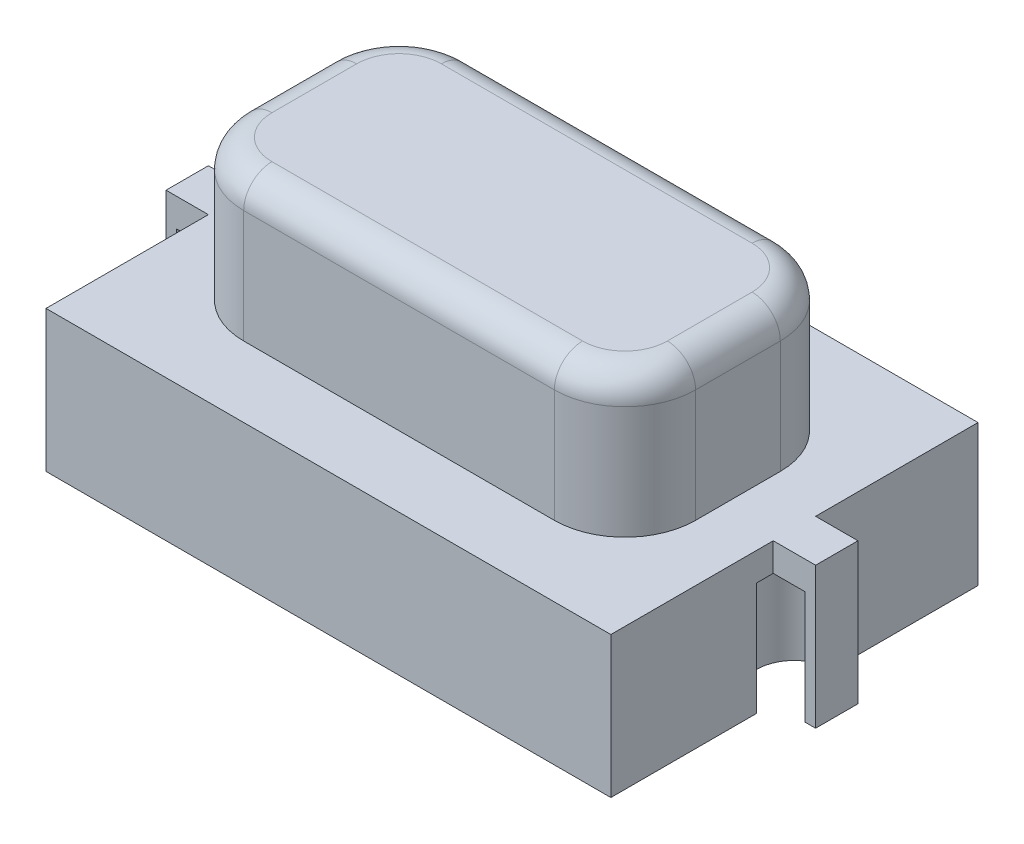
ISO-10303-21;
HEADER;
FILE_DESCRIPTION(('STEP AP214'),'2;1');
FILE_NAME('part.step','',(''),(''),'','','');
FILE_SCHEMA(('AUTOMOTIVE_DESIGN { 1 0 10303 214 1 1 1 1 }'));
ENDSEC;
DATA;
#1=APPLICATION_CONTEXT('core data for automotive mechanical design processes');
#2=APPLICATION_PROTOCOL_DEFINITION('international standard','automotive_design',2000,#1);
#3=PRODUCT_CONTEXT('',#1,'mechanical');
#4=PRODUCT('Part','Part','',(#3));
#5=PRODUCT_RELATED_PRODUCT_CATEGORY('part','',(#4));
#6=PRODUCT_DEFINITION_FORMATION('','',#4);
#7=PRODUCT_DEFINITION_CONTEXT('part definition',#1,'design');
#8=PRODUCT_DEFINITION('design','',#6,#7);
#9=PRODUCT_DEFINITION_SHAPE('','',#8);
#10=(LENGTH_UNIT() NAMED_UNIT(*) SI_UNIT(.MILLI.,.METRE.));
#11=(NAMED_UNIT(*) PLANE_ANGLE_UNIT() SI_UNIT($,.RADIAN.));
#12=(NAMED_UNIT(*) SI_UNIT($,.STERADIAN.) SOLID_ANGLE_UNIT());
#13=UNCERTAINTY_MEASURE_WITH_UNIT(LENGTH_MEASURE(1.E-05),#10,'distance_accuracy_value','');
#14=(GEOMETRIC_REPRESENTATION_CONTEXT(3) GLOBAL_UNCERTAINTY_ASSIGNED_CONTEXT((#13)) GLOBAL_UNIT_ASSIGNED_CONTEXT((#10,
#11,#12)) REPRESENTATION_CONTEXT('',''));
#15=CARTESIAN_POINT('',(0.,0.,0.));
#16=DIRECTION('',(0.,0.,1.));
#17=DIRECTION('',(1.,0.,0.));
#18=AXIS2_PLACEMENT_3D('',#15,#16,#17);
#19=CARTESIAN_POINT('',(10.,-5.,0.));
#20=DIRECTION('',(-1.,0.,0.));
#21=DIRECTION('',(0.,0.,1.));
#22=AXIS2_PLACEMENT_3D('',#19,#20,#21);
#23=PLANE('',#22);
#24=DIRECTION('',(0.,-1.,0.));
#25=VECTOR('',#24,1.);
#26=CARTESIAN_POINT('',(10.,-1.,-1.35));
#27=LINE('',#26,#25);
#28=CARTESIAN_POINT('',(10.,-5.,-1.35));
#29=VERTEX_POINT('',#28);
#30=CARTESIAN_POINT('',(10.,-1.,-1.35));
#31=VERTEX_POINT('',#30);
#32=EDGE_CURVE('E477',#29,#31,#27,.F.);
#33=ORIENTED_EDGE('',*,*,#32,.F.);
#34=DIRECTION('',(0.,0.,1.));
#35=VECTOR('',#34,1.);
#36=CARTESIAN_POINT('',(10.,-5.,0.));
#37=LINE('',#36,#35);
#38=CARTESIAN_POINT('',(10.,-5.,-6.5));
#39=VERTEX_POINT('',#38);
#40=EDGE_CURVE('E290',#39,#29,#37,.T.);
#41=ORIENTED_EDGE('',*,*,#40,.F.);
#42=DIRECTION('',(0.,1.,0.));
#43=VECTOR('',#42,1.);
#44=CARTESIAN_POINT('',(10.,-5.,-6.5));
#45=LINE('',#44,#43);
#46=CARTESIAN_POINT('',(10.,0.,-6.5));
#47=VERTEX_POINT('',#46);
#48=EDGE_CURVE('E319',#39,#47,#45,.T.);
#49=ORIENTED_EDGE('',*,*,#48,.T.);
#50=DIRECTION('',(0.,0.,1.));
#51=VECTOR('',#50,1.);
#52=CARTESIAN_POINT('',(10.,0.,0.));
#53=LINE('',#52,#51);
#54=CARTESIAN_POINT('',(10.,0.,-0.75));
#55=VERTEX_POINT('',#54);
#56=EDGE_CURVE('E320',#47,#55,#53,.T.);
#57=ORIENTED_EDGE('',*,*,#56,.T.);
#58=DIRECTION('',(0.,1.,0.));
#59=VECTOR('',#58,1.);
#60=CARTESIAN_POINT('',(10.,-5.,-0.75));
#61=LINE('',#60,#59);
#62=CARTESIAN_POINT('',(10.,-1.,-0.75));
#63=VERTEX_POINT('',#62);
#64=EDGE_CURVE('E349',#63,#55,#61,.T.);
#65=ORIENTED_EDGE('',*,*,#64,.F.);
#66=DIRECTION('',(0.,0.,-1.));
#67=VECTOR('',#66,1.);
#68=CARTESIAN_POINT('',(10.,-1.,0.));
#69=LINE('',#68,#67);
#70=EDGE_CURVE('E286',#63,#31,#69,.T.);
#71=ORIENTED_EDGE('',*,*,#70,.T.);
#72=EDGE_LOOP('',(#33,#41,#49,#57,#65,#71));
#73=FACE_BOUND('',#72,.T.);
#74=ADVANCED_FACE('F43',(#73),#23,.F.);
#75=CARTESIAN_POINT('',(0.,-5.,-0.750000000000003));
#76=DIRECTION('',(0.,0.,1.));
#77=DIRECTION('',(1.,0.,0.));
#78=AXIS2_PLACEMENT_3D('',#75,#76,#77);
#79=PLANE('',#78);
#80=DIRECTION('',(0.,-1.,0.));
#81=VECTOR('',#80,1.);
#82=CARTESIAN_POINT('',(11.1224972160322,-1.,-0.75));
#83=LINE('',#82,#81);
#84=CARTESIAN_POINT('',(11.1224972160322,-1.,-0.75));
#85=VERTEX_POINT('',#84);
#86=CARTESIAN_POINT('',(11.1224972160322,-5.,-0.75));
#87=VERTEX_POINT('',#86);
#88=EDGE_CURVE('E66',#85,#87,#83,.T.);
#89=ORIENTED_EDGE('',*,*,#88,.F.);
#90=DIRECTION('',(-1.,0.,0.));
#91=VECTOR('',#90,1.);
#92=CARTESIAN_POINT('',(0.,-1.,-0.750000000000003));
#93=LINE('',#92,#91);
#94=EDGE_CURVE('E278',#85,#63,#93,.T.);
#95=ORIENTED_EDGE('',*,*,#94,.T.);
#96=ORIENTED_EDGE('',*,*,#64,.T.);
#97=DIRECTION('',(1.,0.,0.));
#98=VECTOR('',#97,1.);
#99=CARTESIAN_POINT('',(0.,0.,-0.750000000000003));
#100=LINE('',#99,#98);
#101=CARTESIAN_POINT('',(11.5,0.,-0.75));
#102=VERTEX_POINT('',#101);
#103=EDGE_CURVE('E294',#55,#102,#100,.T.);
#104=ORIENTED_EDGE('',*,*,#103,.T.);
#105=DIRECTION('',(0.,1.,0.));
#106=VECTOR('',#105,1.);
#107=CARTESIAN_POINT('',(11.5,-5.,-0.75));
#108=LINE('',#107,#106);
#109=CARTESIAN_POINT('',(11.5,-5.,-0.75));
#110=VERTEX_POINT('',#109);
#111=EDGE_CURVE('E352',#110,#102,#108,.T.);
#112=ORIENTED_EDGE('',*,*,#111,.F.);
#113=DIRECTION('',(1.,0.,0.));
#114=VECTOR('',#113,1.);
#115=CARTESIAN_POINT('',(0.,-5.,-0.750000000000003));
#116=LINE('',#115,#114);
#117=EDGE_CURVE('E317',#87,#110,#116,.T.);
#118=ORIENTED_EDGE('',*,*,#117,.F.);
#119=EDGE_LOOP('',(#89,#95,#96,#104,#112,#118));
#120=FACE_BOUND('',#119,.T.);
#121=ADVANCED_FACE('F502',(#120),#79,.F.);
#122=CARTESIAN_POINT('',(0.,-5.,0.75));
#123=DIRECTION('',(0.,0.,-1.));
#124=DIRECTION('',(-1.,0.,0.));
#125=AXIS2_PLACEMENT_3D('',#122,#123,#124);
#126=PLANE('',#125);
#127=DIRECTION('',(0.,-1.,0.));
#128=VECTOR('',#127,1.);
#129=CARTESIAN_POINT('',(11.1224972160322,-1.,0.75));
#130=LINE('',#129,#128);
#131=CARTESIAN_POINT('',(11.1224972160322,-5.,0.75));
#132=VERTEX_POINT('',#131);
#133=CARTESIAN_POINT('',(11.1224972160322,-1.,0.75));
#134=VERTEX_POINT('',#133);
#135=EDGE_CURVE('E511',#132,#134,#130,.F.);
#136=ORIENTED_EDGE('',*,*,#135,.F.);
#137=DIRECTION('',(-1.,0.,0.));
#138=VECTOR('',#137,1.);
#139=CARTESIAN_POINT('',(0.,-5.,0.75));
#140=LINE('',#139,#138);
#141=CARTESIAN_POINT('',(11.5,-5.,0.75));
#142=VERTEX_POINT('',#141);
#143=EDGE_CURVE('E312',#142,#132,#140,.T.);
#144=ORIENTED_EDGE('',*,*,#143,.F.);
#145=DIRECTION('',(0.,1.,0.));
#146=VECTOR('',#145,1.);
#147=CARTESIAN_POINT('',(11.5,-5.,0.75));
#148=LINE('',#147,#146);
#149=CARTESIAN_POINT('',(11.5,0.,0.75));
#150=VERTEX_POINT('',#149);
#151=EDGE_CURVE('E355',#142,#150,#148,.T.);
#152=ORIENTED_EDGE('',*,*,#151,.T.);
#153=DIRECTION('',(-1.,0.,0.));
#154=VECTOR('',#153,1.);
#155=CARTESIAN_POINT('',(0.,0.,0.75));
#156=LINE('',#155,#154);
#157=CARTESIAN_POINT('',(10.,0.,0.75));
#158=VERTEX_POINT('',#157);
#159=EDGE_CURVE('E343',#150,#158,#156,.T.);
#160=ORIENTED_EDGE('',*,*,#159,.T.);
#161=DIRECTION('',(0.,1.,0.));
#162=VECTOR('',#161,1.);
#163=CARTESIAN_POINT('',(10.,-5.,0.75));
#164=LINE('',#163,#162);
#165=CARTESIAN_POINT('',(10.,-1.,0.75));
#166=VERTEX_POINT('',#165);
#167=EDGE_CURVE('E358',#166,#158,#164,.T.);
#168=ORIENTED_EDGE('',*,*,#167,.F.);
#169=DIRECTION('',(1.,0.,0.));
#170=VECTOR('',#169,1.);
#171=CARTESIAN_POINT('',(0.,-1.,0.75));
#172=LINE('',#171,#170);
#173=EDGE_CURVE('E274',#166,#134,#172,.T.);
#174=ORIENTED_EDGE('',*,*,#173,.T.);
#175=EDGE_LOOP('',(#136,#144,#152,#160,#168,#174));
#176=FACE_BOUND('',#175,.T.);
#177=ADVANCED_FACE('F549',(#176),#126,.F.);
#178=DIRECTION('',(0.,-1.,0.));
#179=VECTOR('',#178,1.);
#180=CARTESIAN_POINT('',(10.,-1.,1.35));
#181=LINE('',#180,#179);
#182=CARTESIAN_POINT('',(10.,-1.,1.35));
#183=VERTEX_POINT('',#182);
#184=CARTESIAN_POINT('',(10.,-5.,1.35));
#185=VERTEX_POINT('',#184);
#186=EDGE_CURVE('E260',#183,#185,#181,.T.);
#187=ORIENTED_EDGE('',*,*,#186,.F.);
#188=DIRECTION('',(0.,0.,-1.));
#189=VECTOR('',#188,1.);
#190=CARTESIAN_POINT('',(10.,-1.,0.));
#191=LINE('',#190,#189);
#192=EDGE_CURVE('E11',#183,#166,#191,.T.);
#193=ORIENTED_EDGE('',*,*,#192,.T.);
#194=ORIENTED_EDGE('',*,*,#167,.T.);
#195=CARTESIAN_POINT('',(10.,0.,6.5));
#196=VERTEX_POINT('',#195);
#197=EDGE_CURVE('E325',#158,#196,#53,.T.);
#198=ORIENTED_EDGE('',*,*,#197,.T.);
#199=DIRECTION('',(0.,1.,0.));
#200=VECTOR('',#199,1.);
#201=CARTESIAN_POINT('',(10.,-5.,6.5));
#202=LINE('',#201,#200);
#203=CARTESIAN_POINT('',(10.,-5.,6.5));
#204=VERTEX_POINT('',#203);
#205=EDGE_CURVE('E360',#204,#196,#202,.T.);
#206=ORIENTED_EDGE('',*,*,#205,.F.);
#207=EDGE_CURVE('E295',#185,#204,#37,.T.);
#208=ORIENTED_EDGE('',*,*,#207,.F.);
#209=EDGE_LOOP('',(#187,#193,#194,#198,#206,#208));
#210=FACE_BOUND('',#209,.T.);
#211=ADVANCED_FACE('F545',(#210),#23,.F.);
#212=CARTESIAN_POINT('',(-10.,-5.,0.));
#213=DIRECTION('',(-1.,0.,0.));
#214=DIRECTION('',(0.,0.,1.));
#215=AXIS2_PLACEMENT_3D('',#212,#213,#214);
#216=PLANE('',#215);
#217=DIRECTION('',(0.,0.,-1.));
#218=VECTOR('',#217,1.);
#219=CARTESIAN_POINT('',(-10.,-1.,0.));
#220=LINE('',#219,#218);
#221=CARTESIAN_POINT('',(-10.,-1.,1.35));
#222=VERTEX_POINT('',#221);
#223=CARTESIAN_POINT('',(-10.,-1.,0.75));
#224=VERTEX_POINT('',#223);
#225=EDGE_CURVE('E265',#222,#224,#220,.T.);
#226=ORIENTED_EDGE('',*,*,#225,.F.);
#227=DIRECTION('',(0.,-1.,0.));
#228=VECTOR('',#227,1.);
#229=CARTESIAN_POINT('',(-10.,-1.,1.35));
#230=LINE('',#229,#228);
#231=CARTESIAN_POINT('',(-10.,-5.,1.35));
#232=VERTEX_POINT('',#231);
#233=EDGE_CURVE('E252',#222,#232,#230,.T.);
#234=ORIENTED_EDGE('',*,*,#233,.T.);
#235=DIRECTION('',(0.,0.,1.));
#236=VECTOR('',#235,1.);
#237=CARTESIAN_POINT('',(-10.,-5.,0.));
#238=LINE('',#237,#236);
#239=CARTESIAN_POINT('',(-10.,-5.,6.5));
#240=VERTEX_POINT('',#239);
#241=EDGE_CURVE('E301',#232,#240,#238,.T.);
#242=ORIENTED_EDGE('',*,*,#241,.T.);
#243=DIRECTION('',(0.,1.,0.));
#244=VECTOR('',#243,1.);
#245=CARTESIAN_POINT('',(-10.,-5.,6.5));
#246=LINE('',#245,#244);
#247=CARTESIAN_POINT('',(-10.,0.,6.5));
#248=VERTEX_POINT('',#247);
#249=EDGE_CURVE('E362',#240,#248,#246,.T.);
#250=ORIENTED_EDGE('',*,*,#249,.T.);
#251=DIRECTION('',(0.,0.,1.));
#252=VECTOR('',#251,1.);
#253=CARTESIAN_POINT('',(-10.,0.,0.));
#254=LINE('',#253,#252);
#255=CARTESIAN_POINT('',(-10.,0.,0.75));
#256=VERTEX_POINT('',#255);
#257=EDGE_CURVE('E331',#256,#248,#254,.T.);
#258=ORIENTED_EDGE('',*,*,#257,.F.);
#259=DIRECTION('',(0.,1.,0.));
#260=VECTOR('',#259,1.);
#261=CARTESIAN_POINT('',(-10.,-5.,0.75));
#262=LINE('',#261,#260);
#263=EDGE_CURVE('E273',#224,#256,#262,.T.);
#264=ORIENTED_EDGE('',*,*,#263,.F.);
#265=EDGE_LOOP('',(#226,#234,#242,#250,#258,#264));
#266=FACE_BOUND('',#265,.T.);
#267=ADVANCED_FACE('F271',(#266),#216,.T.);
#268=CARTESIAN_POINT('',(0.,-5.,0.75));
#269=DIRECTION('',(0.,0.,1.));
#270=DIRECTION('',(1.,0.,0.));
#271=AXIS2_PLACEMENT_3D('',#268,#269,#270);
#272=PLANE('',#271);
#273=DIRECTION('',(1.,0.,0.));
#274=VECTOR('',#273,1.);
#275=CARTESIAN_POINT('',(0.,-5.,0.75));
#276=LINE('',#275,#274);
#277=CARTESIAN_POINT('',(-11.5,-5.,0.75));
#278=VERTEX_POINT('',#277);
#279=CARTESIAN_POINT('',(-11.1224972160322,-5.,0.75));
#280=VERTEX_POINT('',#279);
#281=EDGE_CURVE('E306',#278,#280,#276,.T.);
#282=ORIENTED_EDGE('',*,*,#281,.T.);
#283=DIRECTION('',(0.,-1.,0.));
#284=VECTOR('',#283,1.);
#285=CARTESIAN_POINT('',(-11.1224972160322,-1.,0.75));
#286=LINE('',#285,#284);
#287=CARTESIAN_POINT('',(-11.1224972160322,-1.,0.75));
#288=VERTEX_POINT('',#287);
#289=EDGE_CURVE('E261',#280,#288,#286,.F.);
#290=ORIENTED_EDGE('',*,*,#289,.T.);
#291=DIRECTION('',(-1.,0.,0.));
#292=VECTOR('',#291,1.);
#293=CARTESIAN_POINT('',(0.,-1.,0.75));
#294=LINE('',#293,#292);
#295=EDGE_CURVE('E275',#224,#288,#294,.T.);
#296=ORIENTED_EDGE('',*,*,#295,.F.);
#297=ORIENTED_EDGE('',*,*,#263,.T.);
#298=DIRECTION('',(1.,0.,0.));
#299=VECTOR('',#298,1.);
#300=CARTESIAN_POINT('',(0.,0.,0.75));
#301=LINE('',#300,#299);
#302=CARTESIAN_POINT('',(-11.5,0.,0.75));
#303=VERTEX_POINT('',#302);
#304=EDGE_CURVE('E337',#303,#256,#301,.T.);
#305=ORIENTED_EDGE('',*,*,#304,.F.);
#306=DIRECTION('',(0.,1.,0.));
#307=VECTOR('',#306,1.);
#308=CARTESIAN_POINT('',(-11.5,-5.,0.75));
#309=LINE('',#308,#307);
#310=EDGE_CURVE('E365',#278,#303,#309,.T.);
#311=ORIENTED_EDGE('',*,*,#310,.F.);
#312=EDGE_LOOP('',(#282,#290,#296,#297,#305,#311));
#313=FACE_BOUND('',#312,.T.);
#314=ADVANCED_FACE('F534',(#313),#272,.T.);
#315=CARTESIAN_POINT('',(0.,-5.,-0.750000000000003));
#316=DIRECTION('',(0.,0.,-1.));
#317=DIRECTION('',(-1.,0.,0.));
#318=AXIS2_PLACEMENT_3D('',#315,#316,#317);
#319=PLANE('',#318);
#320=DIRECTION('',(1.,0.,0.));
#321=VECTOR('',#320,1.);
#322=CARTESIAN_POINT('',(0.,-1.,-0.750000000000003));
#323=LINE('',#322,#321);
#324=CARTESIAN_POINT('',(-11.1224972160322,-1.,-0.75));
#325=VERTEX_POINT('',#324);
#326=CARTESIAN_POINT('',(-10.,-1.,-0.75));
#327=VERTEX_POINT('',#326);
#328=EDGE_CURVE('E280',#325,#327,#323,.T.);
#329=ORIENTED_EDGE('',*,*,#328,.F.);
#330=DIRECTION('',(0.,-1.,0.));
#331=VECTOR('',#330,1.);
#332=CARTESIAN_POINT('',(-11.1224972160322,-1.,-0.75));
#333=LINE('',#332,#331);
#334=CARTESIAN_POINT('',(-11.1224972160322,-5.,-0.75));
#335=VERTEX_POINT('',#334);
#336=EDGE_CURVE('E557',#325,#335,#333,.T.);
#337=ORIENTED_EDGE('',*,*,#336,.T.);
#338=DIRECTION('',(-1.,0.,0.));
#339=VECTOR('',#338,1.);
#340=CARTESIAN_POINT('',(0.,-5.,-0.750000000000003));
#341=LINE('',#340,#339);
#342=CARTESIAN_POINT('',(-11.5,-5.,-0.75));
#343=VERTEX_POINT('',#342);
#344=EDGE_CURVE('E300',#335,#343,#341,.T.);
#345=ORIENTED_EDGE('',*,*,#344,.T.);
#346=DIRECTION('',(0.,1.,0.));
#347=VECTOR('',#346,1.);
#348=CARTESIAN_POINT('',(-11.5,-5.,-0.75));
#349=LINE('',#348,#347);
#350=CARTESIAN_POINT('',(-11.5,0.,-0.75));
#351=VERTEX_POINT('',#350);
#352=EDGE_CURVE('E367',#343,#351,#349,.T.);
#353=ORIENTED_EDGE('',*,*,#352,.T.);
#354=DIRECTION('',(-1.,0.,0.));
#355=VECTOR('',#354,1.);
#356=CARTESIAN_POINT('',(0.,0.,-0.750000000000003));
#357=LINE('',#356,#355);
#358=CARTESIAN_POINT('',(-10.,0.,-0.75));
#359=VERTEX_POINT('',#358);
#360=EDGE_CURVE('E330',#359,#351,#357,.T.);
#361=ORIENTED_EDGE('',*,*,#360,.F.);
#362=DIRECTION('',(0.,1.,0.));
#363=VECTOR('',#362,1.);
#364=CARTESIAN_POINT('',(-10.,-5.,-0.75));
#365=LINE('',#364,#363);
#366=EDGE_CURVE('E369',#327,#359,#365,.T.);
#367=ORIENTED_EDGE('',*,*,#366,.F.);
#368=EDGE_LOOP('',(#329,#337,#345,#353,#361,#367));
#369=FACE_BOUND('',#368,.T.);
#370=ADVANCED_FACE('F524',(#369),#319,.T.);
#371=CARTESIAN_POINT('',(-10.,-5.,-6.5));
#372=VERTEX_POINT('',#371);
#373=CARTESIAN_POINT('',(-10.,-5.,-1.35));
#374=VERTEX_POINT('',#373);
#375=EDGE_CURVE('E297',#372,#374,#238,.T.);
#376=ORIENTED_EDGE('',*,*,#375,.T.);
#377=DIRECTION('',(0.,-1.,0.));
#378=VECTOR('',#377,1.);
#379=CARTESIAN_POINT('',(-10.,-1.,-1.35));
#380=LINE('',#379,#378);
#381=CARTESIAN_POINT('',(-10.,-1.,-1.35));
#382=VERTEX_POINT('',#381);
#383=EDGE_CURVE('E58',#374,#382,#380,.F.);
#384=ORIENTED_EDGE('',*,*,#383,.T.);
#385=DIRECTION('',(0.,0.,-1.));
#386=VECTOR('',#385,1.);
#387=CARTESIAN_POINT('',(-10.,-1.,0.));
#388=LINE('',#387,#386);
#389=EDGE_CURVE('E51',#327,#382,#388,.T.);
#390=ORIENTED_EDGE('',*,*,#389,.F.);
#391=ORIENTED_EDGE('',*,*,#366,.T.);
#392=CARTESIAN_POINT('',(-10.,0.,-6.5));
#393=VERTEX_POINT('',#392);
#394=EDGE_CURVE('E327',#393,#359,#254,.T.);
#395=ORIENTED_EDGE('',*,*,#394,.F.);
#396=DIRECTION('',(0.,1.,0.));
#397=VECTOR('',#396,1.);
#398=CARTESIAN_POINT('',(-10.,-5.,-6.5));
#399=LINE('',#398,#397);
#400=EDGE_CURVE('E371',#372,#393,#399,.T.);
#401=ORIENTED_EDGE('',*,*,#400,.F.);
#402=EDGE_LOOP('',(#376,#384,#390,#391,#395,#401));
#403=FACE_BOUND('',#402,.T.);
#404=ADVANCED_FACE('F522',(#403),#216,.T.);
#405=CARTESIAN_POINT('',(0.,-5.,0.));
#406=DIRECTION('',(0.,1.,0.));
#407=DIRECTION('',(0.,0.,1.));
#408=AXIS2_PLACEMENT_3D('',#405,#406,#407);
#409=PLANE('',#408);
#410=CARTESIAN_POINT('',(10.,-5.,0.));
#411=DIRECTION('',(0.,1.,0.));
#412=DIRECTION('',(0.,0.,1.));
#413=AXIS2_PLACEMENT_3D('',#410,#411,#412);
#414=CIRCLE('',#413,1.35);
#415=EDGE_CURVE('E471',#185,#29,#414,.F.);
#416=ORIENTED_EDGE('',*,*,#415,.F.);
#417=ORIENTED_EDGE('',*,*,#207,.T.);
#418=DIRECTION('',(1.,0.,0.));
#419=VECTOR('',#418,1.);
#420=CARTESIAN_POINT('',(0.,-5.,6.5));
#421=LINE('',#420,#419);
#422=EDGE_CURVE('E309',#240,#204,#421,.T.);
#423=ORIENTED_EDGE('',*,*,#422,.F.);
#424=ORIENTED_EDGE('',*,*,#241,.F.);
#425=CARTESIAN_POINT('',(-10.,-5.,0.));
#426=DIRECTION('',(0.,1.,0.));
#427=DIRECTION('',(0.,0.,1.));
#428=AXIS2_PLACEMENT_3D('',#425,#426,#427);
#429=CIRCLE('',#428,1.35);
#430=EDGE_CURVE('E256',#232,#374,#429,.T.);
#431=ORIENTED_EDGE('',*,*,#430,.T.);
#432=ORIENTED_EDGE('',*,*,#375,.F.);
#433=DIRECTION('',(1.,0.,0.));
#434=VECTOR('',#433,1.);
#435=CARTESIAN_POINT('',(0.,-5.,-6.5));
#436=LINE('',#435,#434);
#437=EDGE_CURVE('E293',#372,#39,#436,.T.);
#438=ORIENTED_EDGE('',*,*,#437,.T.);
#439=ORIENTED_EDGE('',*,*,#40,.T.);
#440=EDGE_LOOP('',(#416,#417,#423,#424,#431,#432,#438,#439));
#441=FACE_BOUND('',#440,.T.);
#442=ADVANCED_FACE('F486',(#441),#409,.F.);
#443=CARTESIAN_POINT('',(-10.,-5.,0.));
#444=DIRECTION('',(0.,1.,0.));
#445=DIRECTION('',(0.,0.,1.));
#446=AXIS2_PLACEMENT_3D('',#443,#444,#445);
#447=CIRCLE('',#446,1.35);
#448=EDGE_CURVE('E448',#280,#335,#447,.F.);
#449=ORIENTED_EDGE('',*,*,#448,.F.);
#450=ORIENTED_EDGE('',*,*,#281,.F.);
#451=DIRECTION('',(0.,0.,1.));
#452=VECTOR('',#451,1.);
#453=CARTESIAN_POINT('',(-11.5,-5.,0.));
#454=LINE('',#453,#452);
#455=EDGE_CURVE('E303',#343,#278,#454,.T.);
#456=ORIENTED_EDGE('',*,*,#455,.F.);
#457=ORIENTED_EDGE('',*,*,#344,.F.);
#458=EDGE_LOOP('',(#449,#450,#456,#457));
#459=FACE_BOUND('',#458,.T.);
#460=ADVANCED_FACE('F567',(#459),#409,.F.);
#461=CARTESIAN_POINT('',(-5.5,5.,-1.5));
#462=DIRECTION('',(0.,-1.,0.));
#463=DIRECTION('',(0.,0.,-1.));
#464=AXIS2_PLACEMENT_3D('',#461,#462,#463);
#465=CYLINDRICAL_SURFACE('',#464,2.5);
#466=DIRECTION('',(0.,-1.,0.));
#467=VECTOR('',#466,1.);
#468=CARTESIAN_POINT('',(-8.,5.,-1.5));
#469=LINE('',#468,#467);
#470=CARTESIAN_POINT('',(-8.,4.,-1.5));
#471=VERTEX_POINT('',#470);
#472=CARTESIAN_POINT('',(-8.,0.,-1.5));
#473=VERTEX_POINT('',#472);
#474=EDGE_CURVE('E412',#471,#473,#469,.T.);
#475=ORIENTED_EDGE('',*,*,#474,.F.);
#476=CARTESIAN_POINT('',(-5.5,4.,-1.5));
#477=DIRECTION('',(0.,1.,0.));
#478=DIRECTION('',(0.,0.,1.));
#479=AXIS2_PLACEMENT_3D('',#476,#477,#478);
#480=CIRCLE('',#479,2.5);
#481=CARTESIAN_POINT('',(-5.5,4.,-4.));
#482=VERTEX_POINT('',#481);
#483=EDGE_CURVE('E436',#471,#482,#480,.F.);
#484=ORIENTED_EDGE('',*,*,#483,.T.);
#485=DIRECTION('',(0.,-1.,0.));
#486=VECTOR('',#485,1.);
#487=CARTESIAN_POINT('',(-5.5,5.,-4.));
#488=LINE('',#487,#486);
#489=CARTESIAN_POINT('',(-5.5,0.,-4.));
#490=VERTEX_POINT('',#489);
#491=EDGE_CURVE('E398',#482,#490,#488,.T.);
#492=ORIENTED_EDGE('',*,*,#491,.T.);
#493=CARTESIAN_POINT('',(-5.5,0.,-1.5));
#494=DIRECTION('',(0.,1.,0.));
#495=DIRECTION('',(0.,0.,1.));
#496=AXIS2_PLACEMENT_3D('',#493,#494,#495);
#497=CIRCLE('',#496,2.5);
#498=EDGE_CURVE('E351',#473,#490,#497,.F.);
#499=ORIENTED_EDGE('',*,*,#498,.F.);
#500=EDGE_LOOP('',(#475,#484,#492,#499));
#501=FACE_BOUND('',#500,.T.);
#502=ADVANCED_FACE('F569',(#501),#465,.T.);
#503=CARTESIAN_POINT('',(-8.,5.,0.));
#504=DIRECTION('',(-1.,0.,0.));
#505=DIRECTION('',(0.,0.,1.));
#506=AXIS2_PLACEMENT_3D('',#503,#504,#505);
#507=PLANE('',#506);
#508=DIRECTION('',(0.,-1.,0.));
#509=VECTOR('',#508,1.);
#510=CARTESIAN_POINT('',(-8.,5.,1.5));
#511=LINE('',#510,#509);
#512=CARTESIAN_POINT('',(-8.,4.,1.5));
#513=VERTEX_POINT('',#512);
#514=CARTESIAN_POINT('',(-8.,0.,1.5));
#515=VERTEX_POINT('',#514);
#516=EDGE_CURVE('E410',#513,#515,#511,.T.);
#517=ORIENTED_EDGE('',*,*,#516,.F.);
#518=DIRECTION('',(0.,0.,-1.));
#519=VECTOR('',#518,1.);
#520=CARTESIAN_POINT('',(-8.,4.,0.));
#521=LINE('',#520,#519);
#522=EDGE_CURVE('E434',#513,#471,#521,.T.);
#523=ORIENTED_EDGE('',*,*,#522,.T.);
#524=ORIENTED_EDGE('',*,*,#474,.T.);
#525=DIRECTION('',(0.,0.,-1.));
#526=VECTOR('',#525,1.);
#527=CARTESIAN_POINT('',(-8.,0.,0.));
#528=LINE('',#527,#526);
#529=EDGE_CURVE('E377',#515,#473,#528,.T.);
#530=ORIENTED_EDGE('',*,*,#529,.F.);
#531=EDGE_LOOP('',(#517,#523,#524,#530));
#532=FACE_BOUND('',#531,.T.);
#533=ADVANCED_FACE('F576',(#532),#507,.T.);
#534=CARTESIAN_POINT('',(-5.5,5.,1.5));
#535=DIRECTION('',(0.,-1.,0.));
#536=DIRECTION('',(0.,0.,-1.));
#537=AXIS2_PLACEMENT_3D('',#534,#535,#536);
#538=CYLINDRICAL_SURFACE('',#537,2.5);
#539=DIRECTION('',(0.,-1.,0.));
#540=VECTOR('',#539,1.);
#541=CARTESIAN_POINT('',(-5.5,5.,4.));
#542=LINE('',#541,#540);
#543=CARTESIAN_POINT('',(-5.5,4.,4.));
#544=VERTEX_POINT('',#543);
#545=CARTESIAN_POINT('',(-5.5,0.,4.));
#546=VERTEX_POINT('',#545);
#547=EDGE_CURVE('E408',#544,#546,#542,.T.);
#548=ORIENTED_EDGE('',*,*,#547,.F.);
#549=CARTESIAN_POINT('',(-5.5,4.,1.5));
#550=DIRECTION('',(0.,1.,0.));
#551=DIRECTION('',(0.,0.,1.));
#552=AXIS2_PLACEMENT_3D('',#549,#550,#551);
#553=CIRCLE('',#552,2.5);
#554=EDGE_CURVE('E414',#544,#513,#553,.F.);
#555=ORIENTED_EDGE('',*,*,#554,.T.);
#556=ORIENTED_EDGE('',*,*,#516,.T.);
#557=CARTESIAN_POINT('',(-5.5,0.,1.5));
#558=DIRECTION('',(0.,1.,0.));
#559=DIRECTION('',(0.,0.,1.));
#560=AXIS2_PLACEMENT_3D('',#557,#558,#559);
#561=CIRCLE('',#560,2.5);
#562=EDGE_CURVE('E380',#546,#515,#561,.F.);
#563=ORIENTED_EDGE('',*,*,#562,.F.);
#564=EDGE_LOOP('',(#548,#555,#556,#563));
#565=FACE_BOUND('',#564,.T.);
#566=ADVANCED_FACE('F647',(#565),#538,.T.);
#567=CARTESIAN_POINT('',(0.,5.,4.));
#568=DIRECTION('',(0.,0.,-1.));
#569=DIRECTION('',(-1.,0.,0.));
#570=AXIS2_PLACEMENT_3D('',#567,#568,#569);
#571=PLANE('',#570);
#572=DIRECTION('',(0.,-1.,0.));
#573=VECTOR('',#572,1.);
#574=CARTESIAN_POINT('',(5.5,5.,4.));
#575=LINE('',#574,#573);
#576=CARTESIAN_POINT('',(5.5,4.,4.));
#577=VERTEX_POINT('',#576);
#578=CARTESIAN_POINT('',(5.5,0.,4.));
#579=VERTEX_POINT('',#578);
#580=EDGE_CURVE('E406',#577,#579,#575,.T.);
#581=ORIENTED_EDGE('',*,*,#580,.F.);
#582=DIRECTION('',(1.,0.,0.));
#583=VECTOR('',#582,1.);
#584=CARTESIAN_POINT('',(-5.5,4.,4.));
#585=LINE('',#584,#583);
#586=EDGE_CURVE('E446',#577,#544,#585,.F.);
#587=ORIENTED_EDGE('',*,*,#586,.T.);
#588=ORIENTED_EDGE('',*,*,#547,.T.);
#589=DIRECTION('',(1.,0.,0.));
#590=VECTOR('',#589,1.);
#591=CARTESIAN_POINT('',(0.,0.,4.));
#592=LINE('',#591,#590);
#593=EDGE_CURVE('E383',#546,#579,#592,.T.);
#594=ORIENTED_EDGE('',*,*,#593,.T.);
#595=EDGE_LOOP('',(#581,#587,#588,#594));
#596=FACE_BOUND('',#595,.T.);
#597=ADVANCED_FACE('F641',(#596),#571,.F.);
#598=CARTESIAN_POINT('',(5.5,5.,1.5));
#599=DIRECTION('',(0.,-1.,0.));
#600=DIRECTION('',(0.,0.,-1.));
#601=AXIS2_PLACEMENT_3D('',#598,#599,#600);
#602=CYLINDRICAL_SURFACE('',#601,2.5);
#603=DIRECTION('',(0.,-1.,0.));
#604=VECTOR('',#603,1.);
#605=CARTESIAN_POINT('',(8.,5.,1.5));
#606=LINE('',#605,#604);
#607=CARTESIAN_POINT('',(8.,4.,1.5));
#608=VERTEX_POINT('',#607);
#609=CARTESIAN_POINT('',(8.,0.,1.5));
#610=VERTEX_POINT('',#609);
#611=EDGE_CURVE('E404',#608,#610,#606,.T.);
#612=ORIENTED_EDGE('',*,*,#611,.F.);
#613=CARTESIAN_POINT('',(5.5,4.,1.5));
#614=DIRECTION('',(0.,1.,0.));
#615=DIRECTION('',(0.,0.,1.));
#616=AXIS2_PLACEMENT_3D('',#613,#614,#615);
#617=CIRCLE('',#616,2.5);
#618=EDGE_CURVE('E444',#608,#577,#617,.F.);
#619=ORIENTED_EDGE('',*,*,#618,.T.);
#620=ORIENTED_EDGE('',*,*,#580,.T.);
#621=CARTESIAN_POINT('',(5.5,0.,1.5));
#622=DIRECTION('',(0.,1.,0.));
#623=DIRECTION('',(0.,0.,1.));
#624=AXIS2_PLACEMENT_3D('',#621,#622,#623);
#625=CIRCLE('',#624,2.5);
#626=EDGE_CURVE('E386',#579,#610,#625,.T.);
#627=ORIENTED_EDGE('',*,*,#626,.T.);
#628=EDGE_LOOP('',(#612,#619,#620,#627));
#629=FACE_BOUND('',#628,.T.);
#630=ADVANCED_FACE('F638',(#629),#602,.T.);
#631=CARTESIAN_POINT('',(8.,5.,0.));
#632=DIRECTION('',(-1.,0.,0.));
#633=DIRECTION('',(0.,0.,1.));
#634=AXIS2_PLACEMENT_3D('',#631,#632,#633);
#635=PLANE('',#634);
#636=DIRECTION('',(0.,-1.,0.));
#637=VECTOR('',#636,1.);
#638=CARTESIAN_POINT('',(8.,5.,-1.5));
#639=LINE('',#638,#637);
#640=CARTESIAN_POINT('',(8.,4.,-1.5));
#641=VERTEX_POINT('',#640);
#642=CARTESIAN_POINT('',(8.,0.,-1.5));
#643=VERTEX_POINT('',#642);
#644=EDGE_CURVE('E402',#641,#643,#639,.T.);
#645=ORIENTED_EDGE('',*,*,#644,.F.);
#646=DIRECTION('',(0.,0.,-1.));
#647=VECTOR('',#646,1.);
#648=CARTESIAN_POINT('',(8.,4.,1.5));
#649=LINE('',#648,#647);
#650=EDGE_CURVE('E442',#641,#608,#649,.F.);
#651=ORIENTED_EDGE('',*,*,#650,.T.);
#652=ORIENTED_EDGE('',*,*,#611,.T.);
#653=DIRECTION('',(0.,0.,-1.));
#654=VECTOR('',#653,1.);
#655=CARTESIAN_POINT('',(8.,0.,0.));
#656=LINE('',#655,#654);
#657=EDGE_CURVE('E389',#610,#643,#656,.T.);
#658=ORIENTED_EDGE('',*,*,#657,.T.);
#659=EDGE_LOOP('',(#645,#651,#652,#658));
#660=FACE_BOUND('',#659,.T.);
#661=ADVANCED_FACE('F633',(#660),#635,.F.);
#662=CARTESIAN_POINT('',(5.5,5.,-1.5));
#663=DIRECTION('',(0.,-1.,0.));
#664=DIRECTION('',(0.,0.,-1.));
#665=AXIS2_PLACEMENT_3D('',#662,#663,#664);
#666=CYLINDRICAL_SURFACE('',#665,2.5);
#667=DIRECTION('',(0.,-1.,0.));
#668=VECTOR('',#667,1.);
#669=CARTESIAN_POINT('',(5.5,5.,-4.));
#670=LINE('',#669,#668);
#671=CARTESIAN_POINT('',(5.5,4.,-4.));
#672=VERTEX_POINT('',#671);
#673=CARTESIAN_POINT('',(5.5,0.,-4.));
#674=VERTEX_POINT('',#673);
#675=EDGE_CURVE('E400',#672,#674,#670,.T.);
#676=ORIENTED_EDGE('',*,*,#675,.F.);
#677=CARTESIAN_POINT('',(5.5,4.,-1.5));
#678=DIRECTION('',(0.,1.,0.));
#679=DIRECTION('',(0.,0.,1.));
#680=AXIS2_PLACEMENT_3D('',#677,#678,#679);
#681=CIRCLE('',#680,2.5);
#682=EDGE_CURVE('E440',#672,#641,#681,.F.);
#683=ORIENTED_EDGE('',*,*,#682,.T.);
#684=ORIENTED_EDGE('',*,*,#644,.T.);
#685=CARTESIAN_POINT('',(5.5,0.,-1.5));
#686=DIRECTION('',(0.,1.,0.));
#687=DIRECTION('',(0.,0.,1.));
#688=AXIS2_PLACEMENT_3D('',#685,#686,#687);
#689=CIRCLE('',#688,2.5);
#690=EDGE_CURVE('E392',#674,#643,#689,.F.);
#691=ORIENTED_EDGE('',*,*,#690,.F.);
#692=EDGE_LOOP('',(#676,#683,#684,#691));
#693=FACE_BOUND('',#692,.T.);
#694=ADVANCED_FACE('F628',(#693),#666,.T.);
#695=CARTESIAN_POINT('',(0.,5.,-4.));
#696=DIRECTION('',(0.,0.,-1.));
#697=DIRECTION('',(-1.,0.,0.));
#698=AXIS2_PLACEMENT_3D('',#695,#696,#697);
#699=PLANE('',#698);
#700=ORIENTED_EDGE('',*,*,#491,.F.);
#701=DIRECTION('',(1.,0.,0.));
#702=VECTOR('',#701,1.);
#703=CARTESIAN_POINT('',(0.,4.,-4.));
#704=LINE('',#703,#702);
#705=EDGE_CURVE('E438',#482,#672,#704,.T.);
#706=ORIENTED_EDGE('',*,*,#705,.T.);
#707=ORIENTED_EDGE('',*,*,#675,.T.);
#708=DIRECTION('',(1.,0.,0.));
#709=VECTOR('',#708,1.);
#710=CARTESIAN_POINT('',(0.,0.,-4.));
#711=LINE('',#710,#709);
#712=EDGE_CURVE('E395',#490,#674,#711,.T.);
#713=ORIENTED_EDGE('',*,*,#712,.F.);
#714=EDGE_LOOP('',(#700,#706,#707,#713));
#715=FACE_BOUND('',#714,.T.);
#716=ADVANCED_FACE('F622',(#715),#699,.T.);
#717=CARTESIAN_POINT('',(0.,5.,0.));
#718=DIRECTION('',(0.,1.,0.));
#719=DIRECTION('',(0.,0.,1.));
#720=AXIS2_PLACEMENT_3D('',#717,#718,#719);
#721=PLANE('',#720);
#722=DIRECTION('',(0.,0.,-1.));
#723=VECTOR('',#722,1.);
#724=CARTESIAN_POINT('',(-7.,5.,0.));
#725=LINE('',#724,#723);
#726=CARTESIAN_POINT('',(-7.,5.,-1.5));
#727=VERTEX_POINT('',#726);
#728=CARTESIAN_POINT('',(-7.,5.,1.5));
#729=VERTEX_POINT('',#728);
#730=EDGE_CURVE('E429',#727,#729,#725,.F.);
#731=ORIENTED_EDGE('',*,*,#730,.T.);
#732=CARTESIAN_POINT('',(-5.5,5.,1.5));
#733=DIRECTION('',(0.,1.,0.));
#734=DIRECTION('',(0.,0.,1.));
#735=AXIS2_PLACEMENT_3D('',#732,#733,#734);
#736=CIRCLE('',#735,1.5);
#737=CARTESIAN_POINT('',(-5.5,5.,3.));
#738=VERTEX_POINT('',#737);
#739=EDGE_CURVE('E431',#729,#738,#736,.T.);
#740=ORIENTED_EDGE('',*,*,#739,.T.);
#741=DIRECTION('',(1.,0.,0.));
#742=VECTOR('',#741,1.);
#743=CARTESIAN_POINT('',(5.5,5.,3.));
#744=LINE('',#743,#742);
#745=CARTESIAN_POINT('',(5.5,5.,3.));
#746=VERTEX_POINT('',#745);
#747=EDGE_CURVE('E417',#738,#746,#744,.T.);
#748=ORIENTED_EDGE('',*,*,#747,.T.);
#749=CARTESIAN_POINT('',(5.5,5.,1.5));
#750=DIRECTION('',(0.,1.,0.));
#751=DIRECTION('',(0.,0.,1.));
#752=AXIS2_PLACEMENT_3D('',#749,#750,#751);
#753=CIRCLE('',#752,1.5);
#754=CARTESIAN_POINT('',(7.,5.,1.5));
#755=VERTEX_POINT('',#754);
#756=EDGE_CURVE('E419',#746,#755,#753,.T.);
#757=ORIENTED_EDGE('',*,*,#756,.T.);
#758=DIRECTION('',(0.,0.,-1.));
#759=VECTOR('',#758,1.);
#760=CARTESIAN_POINT('',(7.,5.,-1.5));
#761=LINE('',#760,#759);
#762=CARTESIAN_POINT('',(7.,5.,-1.5));
#763=VERTEX_POINT('',#762);
#764=EDGE_CURVE('E421',#755,#763,#761,.T.);
#765=ORIENTED_EDGE('',*,*,#764,.T.);
#766=CARTESIAN_POINT('',(5.5,5.,-1.5));
#767=DIRECTION('',(0.,1.,0.));
#768=DIRECTION('',(0.,0.,1.));
#769=AXIS2_PLACEMENT_3D('',#766,#767,#768);
#770=CIRCLE('',#769,1.5);
#771=CARTESIAN_POINT('',(5.5,5.,-3.));
#772=VERTEX_POINT('',#771);
#773=EDGE_CURVE('E423',#763,#772,#770,.T.);
#774=ORIENTED_EDGE('',*,*,#773,.T.);
#775=DIRECTION('',(1.,0.,0.));
#776=VECTOR('',#775,1.);
#777=CARTESIAN_POINT('',(0.,5.,-3.));
#778=LINE('',#777,#776);
#779=CARTESIAN_POINT('',(-5.5,5.,-3.));
#780=VERTEX_POINT('',#779);
#781=EDGE_CURVE('E425',#772,#780,#778,.F.);
#782=ORIENTED_EDGE('',*,*,#781,.T.);
#783=CARTESIAN_POINT('',(-5.5,5.,-1.5));
#784=DIRECTION('',(0.,1.,0.));
#785=DIRECTION('',(0.,0.,1.));
#786=AXIS2_PLACEMENT_3D('',#783,#784,#785);
#787=CIRCLE('',#786,1.5);
#788=EDGE_CURVE('E427',#780,#727,#787,.T.);
#789=ORIENTED_EDGE('',*,*,#788,.T.);
#790=EDGE_LOOP('',(#731,#740,#748,#757,#765,#774,#782,#789));
#791=FACE_BOUND('',#790,.T.);
#792=ADVANCED_FACE('F600',(#791),#721,.T.);
#793=CARTESIAN_POINT('',(11.5,-5.,0.));
#794=DIRECTION('',(-1.,0.,0.));
#795=DIRECTION('',(0.,0.,1.));
#796=AXIS2_PLACEMENT_3D('',#793,#794,#795);
#797=PLANE('',#796);
#798=DIRECTION('',(0.,0.,1.));
#799=VECTOR('',#798,1.);
#800=CARTESIAN_POINT('',(11.5,0.,0.));
#801=LINE('',#800,#799);
#802=EDGE_CURVE('E346',#102,#150,#801,.T.);
#803=ORIENTED_EDGE('',*,*,#802,.T.);
#804=ORIENTED_EDGE('',*,*,#151,.F.);
#805=DIRECTION('',(0.,0.,1.));
#806=VECTOR('',#805,1.);
#807=CARTESIAN_POINT('',(11.5,-5.,0.));
#808=LINE('',#807,#806);
#809=EDGE_CURVE('E315',#110,#142,#808,.T.);
#810=ORIENTED_EDGE('',*,*,#809,.F.);
#811=ORIENTED_EDGE('',*,*,#111,.T.);
#812=EDGE_LOOP('',(#803,#804,#810,#811));
#813=FACE_BOUND('',#812,.T.);
#814=ADVANCED_FACE('F506',(#813),#797,.F.);
#815=CARTESIAN_POINT('',(0.,-5.,6.5));
#816=DIRECTION('',(0.,0.,1.));
#817=DIRECTION('',(1.,0.,0.));
#818=AXIS2_PLACEMENT_3D('',#815,#816,#817);
#819=PLANE('',#818);
#820=DIRECTION('',(1.,0.,0.));
#821=VECTOR('',#820,1.);
#822=CARTESIAN_POINT('',(0.,0.,6.5));
#823=LINE('',#822,#821);
#824=EDGE_CURVE('E340',#248,#196,#823,.T.);
#825=ORIENTED_EDGE('',*,*,#824,.F.);
#826=ORIENTED_EDGE('',*,*,#249,.F.);
#827=ORIENTED_EDGE('',*,*,#422,.T.);
#828=ORIENTED_EDGE('',*,*,#205,.T.);
#829=EDGE_LOOP('',(#825,#826,#827,#828));
#830=FACE_BOUND('',#829,.T.);
#831=ADVANCED_FACE('F541',(#830),#819,.T.);
#832=CARTESIAN_POINT('',(-11.5,-5.,0.));
#833=DIRECTION('',(-1.,0.,0.));
#834=DIRECTION('',(0.,0.,1.));
#835=AXIS2_PLACEMENT_3D('',#832,#833,#834);
#836=PLANE('',#835);
#837=DIRECTION('',(0.,0.,1.));
#838=VECTOR('',#837,1.);
#839=CARTESIAN_POINT('',(-11.5,0.,0.));
#840=LINE('',#839,#838);
#841=EDGE_CURVE('E334',#351,#303,#840,.T.);
#842=ORIENTED_EDGE('',*,*,#841,.F.);
#843=ORIENTED_EDGE('',*,*,#352,.F.);
#844=ORIENTED_EDGE('',*,*,#455,.T.);
#845=ORIENTED_EDGE('',*,*,#310,.T.);
#846=EDGE_LOOP('',(#842,#843,#844,#845));
#847=FACE_BOUND('',#846,.T.);
#848=ADVANCED_FACE('F530',(#847),#836,.T.);
#849=CARTESIAN_POINT('',(0.,-5.,-6.5));
#850=DIRECTION('',(0.,0.,1.));
#851=DIRECTION('',(1.,0.,0.));
#852=AXIS2_PLACEMENT_3D('',#849,#850,#851);
#853=PLANE('',#852);
#854=DIRECTION('',(1.,0.,0.));
#855=VECTOR('',#854,1.);
#856=CARTESIAN_POINT('',(0.,0.,-6.5));
#857=LINE('',#856,#855);
#858=EDGE_CURVE('E323',#393,#47,#857,.T.);
#859=ORIENTED_EDGE('',*,*,#858,.T.);
#860=ORIENTED_EDGE('',*,*,#48,.F.);
#861=ORIENTED_EDGE('',*,*,#437,.F.);
#862=ORIENTED_EDGE('',*,*,#400,.T.);
#863=EDGE_LOOP('',(#859,#860,#861,#862));
#864=FACE_BOUND('',#863,.T.);
#865=ADVANCED_FACE('F491',(#864),#853,.F.);
#866=EDGE_CURVE('E470',#87,#132,#414,.F.);
#867=ORIENTED_EDGE('',*,*,#866,.F.);
#868=ORIENTED_EDGE('',*,*,#117,.T.);
#869=ORIENTED_EDGE('',*,*,#809,.T.);
#870=ORIENTED_EDGE('',*,*,#143,.T.);
#871=EDGE_LOOP('',(#867,#868,#869,#870));
#872=FACE_BOUND('',#871,.T.);
#873=ADVANCED_FACE('F510',(#872),#409,.F.);
#874=CARTESIAN_POINT('',(0.,0.,0.));
#875=DIRECTION('',(0.,1.,0.));
#876=DIRECTION('',(0.,0.,1.));
#877=AXIS2_PLACEMENT_3D('',#874,#875,#876);
#878=PLANE('',#877);
#879=ORIENTED_EDGE('',*,*,#529,.T.);
#880=ORIENTED_EDGE('',*,*,#498,.T.);
#881=ORIENTED_EDGE('',*,*,#712,.T.);
#882=ORIENTED_EDGE('',*,*,#690,.T.);
#883=ORIENTED_EDGE('',*,*,#657,.F.);
#884=ORIENTED_EDGE('',*,*,#626,.F.);
#885=ORIENTED_EDGE('',*,*,#593,.F.);
#886=ORIENTED_EDGE('',*,*,#562,.T.);
#887=EDGE_LOOP('',(#879,#880,#881,#882,#883,#884,#885,#886));
#888=FACE_BOUND('',#887,.T.);
#889=ORIENTED_EDGE('',*,*,#56,.F.);
#890=ORIENTED_EDGE('',*,*,#858,.F.);
#891=ORIENTED_EDGE('',*,*,#394,.T.);
#892=ORIENTED_EDGE('',*,*,#360,.T.);
#893=ORIENTED_EDGE('',*,*,#841,.T.);
#894=ORIENTED_EDGE('',*,*,#304,.T.);
#895=ORIENTED_EDGE('',*,*,#257,.T.);
#896=ORIENTED_EDGE('',*,*,#824,.T.);
#897=ORIENTED_EDGE('',*,*,#197,.F.);
#898=ORIENTED_EDGE('',*,*,#159,.F.);
#899=ORIENTED_EDGE('',*,*,#802,.F.);
#900=ORIENTED_EDGE('',*,*,#103,.F.);
#901=EDGE_LOOP('',(#889,#890,#891,#892,#893,#894,#895,#896,#897,#898,#899,#900));
#902=FACE_BOUND('',#901,.T.);
#903=ADVANCED_FACE('F496',(#888,#902),#878,.T.);
#904=CARTESIAN_POINT('',(5.5,4.,-1.5));
#905=DIRECTION('',(0.,1.,0.));
#906=DIRECTION('',(0.,0.,1.));
#907=AXIS2_PLACEMENT_3D('',#904,#905,#906);
#908=TOROIDAL_SURFACE('',#907,1.5,1.);
#909=CARTESIAN_POINT('',(5.5,4.,-3.));
#910=DIRECTION('',(-1.,0.,0.));
#911=DIRECTION('',(0.,0.,1.));
#912=AXIS2_PLACEMENT_3D('',#909,#910,#911);
#913=CIRCLE('',#912,1.);
#914=EDGE_CURVE('E464',#772,#672,#913,.T.);
#915=ORIENTED_EDGE('',*,*,#914,.F.);
#916=ORIENTED_EDGE('',*,*,#773,.F.);
#917=CARTESIAN_POINT('',(7.,4.,-1.5));
#918=DIRECTION('',(0.,0.,1.));
#919=DIRECTION('',(1.,0.,0.));
#920=AXIS2_PLACEMENT_3D('',#917,#918,#919);
#921=CIRCLE('',#920,1.);
#922=EDGE_CURVE('E324',#641,#763,#921,.T.);
#923=ORIENTED_EDGE('',*,*,#922,.F.);
#924=ORIENTED_EDGE('',*,*,#682,.F.);
#925=EDGE_LOOP('',(#915,#916,#923,#924));
#926=FACE_BOUND('',#925,.T.);
#927=ADVANCED_FACE('F45',(#926),#908,.T.);
#928=CARTESIAN_POINT('',(7.,4.,0.));
#929=DIRECTION('',(0.,0.,1.));
#930=DIRECTION('',(1.,0.,0.));
#931=AXIS2_PLACEMENT_3D('',#928,#929,#930);
#932=CYLINDRICAL_SURFACE('',#931,1.);
#933=ORIENTED_EDGE('',*,*,#922,.T.);
#934=ORIENTED_EDGE('',*,*,#764,.F.);
#935=CARTESIAN_POINT('',(7.,4.,1.5));
#936=DIRECTION('',(0.,0.,1.));
#937=DIRECTION('',(1.,0.,0.));
#938=AXIS2_PLACEMENT_3D('',#935,#936,#937);
#939=CIRCLE('',#938,1.);
#940=EDGE_CURVE('E461',#608,#755,#939,.T.);
#941=ORIENTED_EDGE('',*,*,#940,.F.);
#942=ORIENTED_EDGE('',*,*,#650,.F.);
#943=EDGE_LOOP('',(#933,#934,#941,#942));
#944=FACE_BOUND('',#943,.T.);
#945=ADVANCED_FACE('F607',(#944),#932,.T.);
#946=CARTESIAN_POINT('',(0.,4.,-3.));
#947=DIRECTION('',(1.,0.,0.));
#948=DIRECTION('',(0.,0.,-1.));
#949=AXIS2_PLACEMENT_3D('',#946,#947,#948);
#950=CYLINDRICAL_SURFACE('',#949,1.);
#951=ORIENTED_EDGE('',*,*,#914,.T.);
#952=ORIENTED_EDGE('',*,*,#705,.F.);
#953=CARTESIAN_POINT('',(-5.5,4.,-3.));
#954=DIRECTION('',(-1.,0.,0.));
#955=DIRECTION('',(0.,0.,1.));
#956=AXIS2_PLACEMENT_3D('',#953,#954,#955);
#957=CIRCLE('',#956,1.);
#958=EDGE_CURVE('E458',#780,#482,#957,.T.);
#959=ORIENTED_EDGE('',*,*,#958,.F.);
#960=ORIENTED_EDGE('',*,*,#781,.F.);
#961=EDGE_LOOP('',(#951,#952,#959,#960));
#962=FACE_BOUND('',#961,.T.);
#963=ADVANCED_FACE('F664',(#962),#950,.T.);
#964=CARTESIAN_POINT('',(5.5,4.,1.5));
#965=DIRECTION('',(0.,1.,0.));
#966=DIRECTION('',(0.,0.,1.));
#967=AXIS2_PLACEMENT_3D('',#964,#965,#966);
#968=TOROIDAL_SURFACE('',#967,1.5,1.);
#969=ORIENTED_EDGE('',*,*,#940,.T.);
#970=ORIENTED_EDGE('',*,*,#756,.F.);
#971=CARTESIAN_POINT('',(5.5,4.,3.));
#972=DIRECTION('',(-1.,0.,0.));
#973=DIRECTION('',(0.,0.,1.));
#974=AXIS2_PLACEMENT_3D('',#971,#972,#973);
#975=CIRCLE('',#974,1.);
#976=EDGE_CURVE('E455',#577,#746,#975,.T.);
#977=ORIENTED_EDGE('',*,*,#976,.F.);
#978=ORIENTED_EDGE('',*,*,#618,.F.);
#979=EDGE_LOOP('',(#969,#970,#977,#978));
#980=FACE_BOUND('',#979,.T.);
#981=ADVANCED_FACE('F672',(#980),#968,.T.);
#982=CARTESIAN_POINT('',(-5.5,4.,-1.5));
#983=DIRECTION('',(0.,1.,0.));
#984=DIRECTION('',(0.,0.,1.));
#985=AXIS2_PLACEMENT_3D('',#982,#983,#984);
#986=TOROIDAL_SURFACE('',#985,1.5,1.);
#987=ORIENTED_EDGE('',*,*,#958,.T.);
#988=ORIENTED_EDGE('',*,*,#483,.F.);
#989=CARTESIAN_POINT('',(-7.,4.,-1.5));
#990=DIRECTION('',(0.,0.,1.));
#991=DIRECTION('',(1.,0.,0.));
#992=AXIS2_PLACEMENT_3D('',#989,#990,#991);
#993=CIRCLE('',#992,1.);
#994=EDGE_CURVE('E452',#727,#471,#993,.T.);
#995=ORIENTED_EDGE('',*,*,#994,.F.);
#996=ORIENTED_EDGE('',*,*,#788,.F.);
#997=EDGE_LOOP('',(#987,#988,#995,#996));
#998=FACE_BOUND('',#997,.T.);
#999=ADVANCED_FACE('F660',(#998),#986,.T.);
#1000=CARTESIAN_POINT('',(0.,4.,3.));
#1001=DIRECTION('',(-1.,0.,0.));
#1002=DIRECTION('',(0.,0.,1.));
#1003=AXIS2_PLACEMENT_3D('',#1000,#1001,#1002);
#1004=CYLINDRICAL_SURFACE('',#1003,1.);
#1005=ORIENTED_EDGE('',*,*,#976,.T.);
#1006=ORIENTED_EDGE('',*,*,#747,.F.);
#1007=CARTESIAN_POINT('',(-5.5,4.,3.));
#1008=DIRECTION('',(-1.,0.,0.));
#1009=DIRECTION('',(0.,0.,1.));
#1010=AXIS2_PLACEMENT_3D('',#1007,#1008,#1009);
#1011=CIRCLE('',#1010,1.);
#1012=EDGE_CURVE('E450',#544,#738,#1011,.T.);
#1013=ORIENTED_EDGE('',*,*,#1012,.F.);
#1014=ORIENTED_EDGE('',*,*,#586,.F.);
#1015=EDGE_LOOP('',(#1005,#1006,#1013,#1014));
#1016=FACE_BOUND('',#1015,.T.);
#1017=ADVANCED_FACE('F674',(#1016),#1004,.T.);
#1018=CARTESIAN_POINT('',(-7.,4.,0.));
#1019=DIRECTION('',(0.,0.,-1.));
#1020=DIRECTION('',(-1.,0.,0.));
#1021=AXIS2_PLACEMENT_3D('',#1018,#1019,#1020);
#1022=CYLINDRICAL_SURFACE('',#1021,1.);
#1023=ORIENTED_EDGE('',*,*,#994,.T.);
#1024=ORIENTED_EDGE('',*,*,#522,.F.);
#1025=CARTESIAN_POINT('',(-7.,4.,1.5));
#1026=DIRECTION('',(0.,0.,1.));
#1027=DIRECTION('',(1.,0.,0.));
#1028=AXIS2_PLACEMENT_3D('',#1025,#1026,#1027);
#1029=CIRCLE('',#1028,1.);
#1030=EDGE_CURVE('E289',#729,#513,#1029,.T.);
#1031=ORIENTED_EDGE('',*,*,#1030,.F.);
#1032=ORIENTED_EDGE('',*,*,#730,.F.);
#1033=EDGE_LOOP('',(#1023,#1024,#1031,#1032));
#1034=FACE_BOUND('',#1033,.T.);
#1035=ADVANCED_FACE('F656',(#1034),#1022,.T.);
#1036=CARTESIAN_POINT('',(-5.5,4.,1.5));
#1037=DIRECTION('',(0.,1.,0.));
#1038=DIRECTION('',(0.,0.,1.));
#1039=AXIS2_PLACEMENT_3D('',#1036,#1037,#1038);
#1040=TOROIDAL_SURFACE('',#1039,1.5,1.);
#1041=ORIENTED_EDGE('',*,*,#1012,.T.);
#1042=ORIENTED_EDGE('',*,*,#739,.F.);
#1043=ORIENTED_EDGE('',*,*,#1030,.T.);
#1044=ORIENTED_EDGE('',*,*,#554,.F.);
#1045=EDGE_LOOP('',(#1041,#1042,#1043,#1044));
#1046=FACE_BOUND('',#1045,.T.);
#1047=ADVANCED_FACE('F650',(#1046),#1040,.T.);
#1048=CARTESIAN_POINT('',(-10.,-1.,0.));
#1049=DIRECTION('',(0.,-1.,0.));
#1050=DIRECTION('',(0.,0.,-1.));
#1051=AXIS2_PLACEMENT_3D('',#1048,#1049,#1050);
#1052=CYLINDRICAL_SURFACE('',#1051,1.35);
#1053=CARTESIAN_POINT('',(-10.,-1.,0.));
#1054=DIRECTION('',(0.,1.,0.));
#1055=DIRECTION('',(0.,0.,1.));
#1056=AXIS2_PLACEMENT_3D('',#1053,#1054,#1055);
#1057=CIRCLE('',#1056,1.35);
#1058=EDGE_CURVE('E255',#222,#382,#1057,.T.);
#1059=ORIENTED_EDGE('',*,*,#1058,.T.);
#1060=ORIENTED_EDGE('',*,*,#383,.F.);
#1061=ORIENTED_EDGE('',*,*,#430,.F.);
#1062=ORIENTED_EDGE('',*,*,#233,.F.);
#1063=EDGE_LOOP('',(#1059,#1060,#1061,#1062));
#1064=FACE_BOUND('',#1063,.T.);
#1065=ADVANCED_FACE('F254',(#1064),#1052,.F.);
#1066=ORIENTED_EDGE('',*,*,#448,.T.);
#1067=ORIENTED_EDGE('',*,*,#336,.F.);
#1068=EDGE_CURVE('E268',#325,#288,#1057,.T.);
#1069=ORIENTED_EDGE('',*,*,#1068,.T.);
#1070=ORIENTED_EDGE('',*,*,#289,.F.);
#1071=EDGE_LOOP('',(#1066,#1067,#1069,#1070));
#1072=FACE_BOUND('',#1071,.T.);
#1073=ADVANCED_FACE('F564',(#1072),#1052,.F.);
#1074=CARTESIAN_POINT('',(-10.,-1.,0.));
#1075=DIRECTION('',(0.,1.,0.));
#1076=DIRECTION('',(0.,0.,1.));
#1077=AXIS2_PLACEMENT_3D('',#1074,#1075,#1076);
#1078=PLANE('',#1077);
#1079=ORIENTED_EDGE('',*,*,#225,.T.);
#1080=ORIENTED_EDGE('',*,*,#295,.T.);
#1081=ORIENTED_EDGE('',*,*,#1068,.F.);
#1082=ORIENTED_EDGE('',*,*,#328,.T.);
#1083=ORIENTED_EDGE('',*,*,#389,.T.);
#1084=ORIENTED_EDGE('',*,*,#1058,.F.);
#1085=EDGE_LOOP('',(#1079,#1080,#1081,#1082,#1083,#1084));
#1086=FACE_BOUND('',#1085,.T.);
#1087=ADVANCED_FACE('F264',(#1086),#1078,.F.);
#1088=CARTESIAN_POINT('',(10.,-1.,0.));
#1089=DIRECTION('',(0.,1.,0.));
#1090=DIRECTION('',(0.,0.,1.));
#1091=AXIS2_PLACEMENT_3D('',#1088,#1089,#1090);
#1092=PLANE('',#1091);
#1093=ORIENTED_EDGE('',*,*,#94,.F.);
#1094=CARTESIAN_POINT('',(10.,-1.,0.));
#1095=DIRECTION('',(0.,1.,0.));
#1096=DIRECTION('',(0.,0.,1.));
#1097=AXIS2_PLACEMENT_3D('',#1094,#1095,#1096);
#1098=CIRCLE('',#1097,1.35);
#1099=EDGE_CURVE('E552',#134,#85,#1098,.T.);
#1100=ORIENTED_EDGE('',*,*,#1099,.F.);
#1101=ORIENTED_EDGE('',*,*,#173,.F.);
#1102=ORIENTED_EDGE('',*,*,#192,.F.);
#1103=EDGE_CURVE('E555',#31,#183,#1098,.T.);
#1104=ORIENTED_EDGE('',*,*,#1103,.F.);
#1105=ORIENTED_EDGE('',*,*,#70,.F.);
#1106=EDGE_LOOP('',(#1093,#1100,#1101,#1102,#1104,#1105));
#1107=FACE_BOUND('',#1106,.T.);
#1108=ADVANCED_FACE('F554',(#1107),#1092,.F.);
#1109=CARTESIAN_POINT('',(10.,-1.,0.));
#1110=DIRECTION('',(0.,-1.,0.));
#1111=DIRECTION('',(0.,0.,-1.));
#1112=AXIS2_PLACEMENT_3D('',#1109,#1110,#1111);
#1113=CYLINDRICAL_SURFACE('',#1112,1.35);
#1114=ORIENTED_EDGE('',*,*,#32,.T.);
#1115=ORIENTED_EDGE('',*,*,#1103,.T.);
#1116=ORIENTED_EDGE('',*,*,#186,.T.);
#1117=ORIENTED_EDGE('',*,*,#415,.T.);
#1118=EDGE_LOOP('',(#1114,#1115,#1116,#1117));
#1119=FACE_BOUND('',#1118,.T.);
#1120=ADVANCED_FACE('F475',(#1119),#1113,.F.);
#1121=ORIENTED_EDGE('',*,*,#88,.T.);
#1122=ORIENTED_EDGE('',*,*,#866,.T.);
#1123=ORIENTED_EDGE('',*,*,#135,.T.);
#1124=ORIENTED_EDGE('',*,*,#1099,.T.);
#1125=EDGE_LOOP('',(#1121,#1122,#1123,#1124));
#1126=FACE_BOUND('',#1125,.T.);
#1127=ADVANCED_FACE('F551',(#1126),#1113,.F.);
#1128=CLOSED_SHELL('',(#74,#121,#177,#211,#267,#314,#370,#404,#442,#460,#502,#533,#566,#597,
#630,#661,#694,#716,#792,#814,#831,#848,#865,#873,#903,#927,#945,#963,#981,#999,#1017,#1035,
#1047,#1065,#1073,#1087,#1108,#1120,#1127));
#1129=MANIFOLD_SOLID_BREP('B2',#1128);
#1130=ADVANCED_BREP_SHAPE_REPRESENTATION('',(#18,#1129),#14);
#1131=SHAPE_DEFINITION_REPRESENTATION(#9,#1130);
ENDSEC;
END-ISO-10303-21;
